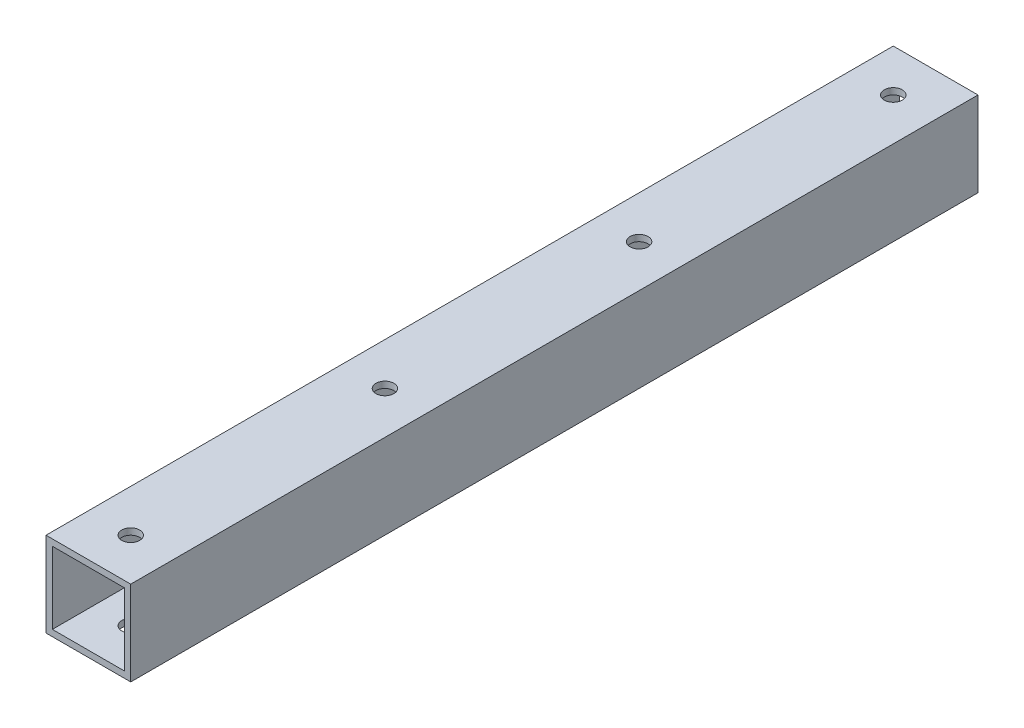
ISO-10303-21;
HEADER;
FILE_DESCRIPTION(('STEP AP214'),'2;1');
FILE_NAME('part.step','',(''),(''),'','','');
FILE_SCHEMA(('AUTOMOTIVE_DESIGN { 1 0 10303 214 1 1 1 1 }'));
ENDSEC;
DATA;
#1=APPLICATION_CONTEXT('core data for automotive mechanical design processes');
#2=APPLICATION_PROTOCOL_DEFINITION('international standard','automotive_design',2000,#1);
#3=PRODUCT_CONTEXT('',#1,'mechanical');
#4=PRODUCT('Part','Part','',(#3));
#5=PRODUCT_RELATED_PRODUCT_CATEGORY('part','',(#4));
#6=PRODUCT_DEFINITION_FORMATION('','',#4);
#7=PRODUCT_DEFINITION_CONTEXT('part definition',#1,'design');
#8=PRODUCT_DEFINITION('design','',#6,#7);
#9=PRODUCT_DEFINITION_SHAPE('','',#8);
#10=(LENGTH_UNIT() NAMED_UNIT(*) SI_UNIT(.MILLI.,.METRE.));
#11=(NAMED_UNIT(*) PLANE_ANGLE_UNIT() SI_UNIT($,.RADIAN.));
#12=(NAMED_UNIT(*) SI_UNIT($,.STERADIAN.) SOLID_ANGLE_UNIT());
#13=UNCERTAINTY_MEASURE_WITH_UNIT(LENGTH_MEASURE(1.E-05),#10,'distance_accuracy_value','');
#14=(GEOMETRIC_REPRESENTATION_CONTEXT(3) GLOBAL_UNCERTAINTY_ASSIGNED_CONTEXT((#13)) GLOBAL_UNIT_ASSIGNED_CONTEXT((#10,
#11,#12)) REPRESENTATION_CONTEXT('',''));
#15=CARTESIAN_POINT('',(0.,0.,0.));
#16=DIRECTION('',(0.,0.,1.));
#17=DIRECTION('',(1.,0.,0.));
#18=AXIS2_PLACEMENT_3D('',#15,#16,#17);
#19=CARTESIAN_POINT('',(10.,-9.99999999999999,-200.));
#20=DIRECTION('',(1.,0.,0.));
#21=DIRECTION('',(0.,0.,-1.));
#22=AXIS2_PLACEMENT_3D('',#19,#20,#21);
#23=PLANE('',#22);
#24=DIRECTION('',(0.,1.,0.));
#25=VECTOR('',#24,1.);
#26=CARTESIAN_POINT('',(10.,-9.99999999999999,0.));
#27=LINE('',#26,#25);
#28=CARTESIAN_POINT('',(10.,-9.99999999999999,0.));
#29=VERTEX_POINT('',#28);
#30=CARTESIAN_POINT('',(10.,10.,0.));
#31=VERTEX_POINT('',#30);
#32=EDGE_CURVE('E142',#29,#31,#27,.T.);
#33=ORIENTED_EDGE('',*,*,#32,.F.);
#34=DIRECTION('',(0.,0.,1.));
#35=VECTOR('',#34,1.);
#36=CARTESIAN_POINT('',(10.,-9.99999999999999,-200.));
#37=LINE('',#36,#35);
#38=CARTESIAN_POINT('',(10.,-9.99999999999999,-200.));
#39=VERTEX_POINT('',#38);
#40=EDGE_CURVE('E11',#39,#29,#37,.T.);
#41=ORIENTED_EDGE('',*,*,#40,.F.);
#42=DIRECTION('',(0.,1.,0.));
#43=VECTOR('',#42,1.);
#44=CARTESIAN_POINT('',(10.,-9.99999999999999,-200.));
#45=LINE('',#44,#43);
#46=CARTESIAN_POINT('',(10.,10.,-200.));
#47=VERTEX_POINT('',#46);
#48=EDGE_CURVE('E146',#39,#47,#45,.T.);
#49=ORIENTED_EDGE('',*,*,#48,.T.);
#50=DIRECTION('',(0.,0.,1.));
#51=VECTOR('',#50,1.);
#52=CARTESIAN_POINT('',(10.,10.,-200.));
#53=LINE('',#52,#51);
#54=EDGE_CURVE('E159',#47,#31,#53,.T.);
#55=ORIENTED_EDGE('',*,*,#54,.T.);
#56=EDGE_LOOP('',(#33,#41,#49,#55));
#57=FACE_BOUND('',#56,.T.);
#58=ADVANCED_FACE('F41',(#57),#23,.T.);
#59=CARTESIAN_POINT('',(-9.99999999999998,-9.99999999999999,-200.));
#60=DIRECTION('',(0.,-1.,0.));
#61=DIRECTION('',(0.,0.,-1.));
#62=AXIS2_PLACEMENT_3D('',#59,#60,#61);
#63=PLANE('',#62);
#64=CARTESIAN_POINT('',(0.,-9.99999999999999,-10.));
#65=DIRECTION('',(0.,1.,0.));
#66=DIRECTION('',(0.,0.,1.));
#67=AXIS2_PLACEMENT_3D('',#64,#65,#66);
#68=CIRCLE('',#67,2.125);
#69=CARTESIAN_POINT('',(0.,-9.99999999999999,-7.875));
#70=VERTEX_POINT('',#69);
#71=EDGE_CURVE('E178',#70,#70,#68,.T.);
#72=ORIENTED_EDGE('',*,*,#71,.T.);
#73=EDGE_LOOP('',(#72));
#74=FACE_BOUND('',#73,.T.);
#75=CARTESIAN_POINT('',(-2.05814939933146E-13,-9.99999999999999,-70.));
#76=DIRECTION('',(0.,1.,0.));
#77=DIRECTION('',(0.,0.,1.));
#78=AXIS2_PLACEMENT_3D('',#75,#76,#77);
#79=CIRCLE('',#78,2.125);
#80=CARTESIAN_POINT('',(-2.05814939933146E-13,-9.99999999999999,-67.875));
#81=VERTEX_POINT('',#80);
#82=EDGE_CURVE('E207',#81,#81,#79,.T.);
#83=ORIENTED_EDGE('',*,*,#82,.T.);
#84=EDGE_LOOP('',(#83));
#85=FACE_BOUND('',#84,.T.);
#86=CARTESIAN_POINT('',(-4.11629879866292E-13,-9.99999999999999,-130.));
#87=DIRECTION('',(0.,1.,0.));
#88=DIRECTION('',(0.,0.,1.));
#89=AXIS2_PLACEMENT_3D('',#86,#87,#88);
#90=CIRCLE('',#89,2.125);
#91=CARTESIAN_POINT('',(-4.11629879866292E-13,-9.99999999999999,-127.875));
#92=VERTEX_POINT('',#91);
#93=EDGE_CURVE('E201',#92,#92,#90,.T.);
#94=ORIENTED_EDGE('',*,*,#93,.T.);
#95=EDGE_LOOP('',(#94));
#96=FACE_BOUND('',#95,.T.);
#97=CARTESIAN_POINT('',(-6.17444819799438E-13,-9.99999999999999,-190.));
#98=DIRECTION('',(0.,1.,0.));
#99=DIRECTION('',(0.,0.,1.));
#100=AXIS2_PLACEMENT_3D('',#97,#98,#99);
#101=CIRCLE('',#100,2.125);
#102=CARTESIAN_POINT('',(-6.17444819799438E-13,-9.99999999999999,-187.875));
#103=VERTEX_POINT('',#102);
#104=EDGE_CURVE('E195',#103,#103,#101,.T.);
#105=ORIENTED_EDGE('',*,*,#104,.T.);
#106=EDGE_LOOP('',(#105));
#107=FACE_BOUND('',#106,.T.);
#108=DIRECTION('',(1.,0.,0.));
#109=VECTOR('',#108,1.);
#110=CARTESIAN_POINT('',(-9.99999999999998,-9.99999999999999,0.));
#111=LINE('',#110,#109);
#112=CARTESIAN_POINT('',(-9.99999999999998,-9.99999999999999,0.));
#113=VERTEX_POINT('',#112);
#114=EDGE_CURVE('E150',#113,#29,#111,.T.);
#115=ORIENTED_EDGE('',*,*,#114,.F.);
#116=DIRECTION('',(0.,0.,1.));
#117=VECTOR('',#116,1.);
#118=CARTESIAN_POINT('',(-9.99999999999998,-9.99999999999999,-200.));
#119=LINE('',#118,#117);
#120=CARTESIAN_POINT('',(-9.99999999999998,-9.99999999999999,-200.));
#121=VERTEX_POINT('',#120);
#122=EDGE_CURVE('E49',#121,#113,#119,.T.);
#123=ORIENTED_EDGE('',*,*,#122,.F.);
#124=DIRECTION('',(1.,0.,0.));
#125=VECTOR('',#124,1.);
#126=CARTESIAN_POINT('',(-9.99999999999998,-9.99999999999999,-200.));
#127=LINE('',#126,#125);
#128=EDGE_CURVE('E156',#121,#39,#127,.T.);
#129=ORIENTED_EDGE('',*,*,#128,.T.);
#130=ORIENTED_EDGE('',*,*,#40,.T.);
#131=EDGE_LOOP('',(#115,#123,#129,#130));
#132=FACE_BOUND('',#131,.T.);
#133=ADVANCED_FACE('F219',(#74,#85,#96,#107,#132),#63,.T.);
#134=CARTESIAN_POINT('',(-9.99999999999998,-9.99999999999999,-200.));
#135=DIRECTION('',(-1.,0.,0.));
#136=DIRECTION('',(0.,0.,1.));
#137=AXIS2_PLACEMENT_3D('',#134,#135,#136);
#138=PLANE('',#137);
#139=DIRECTION('',(0.,-1.,0.));
#140=VECTOR('',#139,1.);
#141=CARTESIAN_POINT('',(-9.99999999999998,-9.99999999999999,0.));
#142=LINE('',#141,#140);
#143=CARTESIAN_POINT('',(-9.99999999999998,10.,0.));
#144=VERTEX_POINT('',#143);
#145=EDGE_CURVE('E165',#144,#113,#142,.T.);
#146=ORIENTED_EDGE('',*,*,#145,.F.);
#147=DIRECTION('',(0.,0.,1.));
#148=VECTOR('',#147,1.);
#149=CARTESIAN_POINT('',(-9.99999999999998,10.,-200.));
#150=LINE('',#149,#148);
#151=CARTESIAN_POINT('',(-9.99999999999998,10.,-200.));
#152=VERTEX_POINT('',#151);
#153=EDGE_CURVE('E171',#152,#144,#150,.T.);
#154=ORIENTED_EDGE('',*,*,#153,.F.);
#155=DIRECTION('',(0.,-1.,0.));
#156=VECTOR('',#155,1.);
#157=CARTESIAN_POINT('',(-9.99999999999998,-9.99999999999999,-200.));
#158=LINE('',#157,#156);
#159=EDGE_CURVE('E153',#152,#121,#158,.T.);
#160=ORIENTED_EDGE('',*,*,#159,.T.);
#161=ORIENTED_EDGE('',*,*,#122,.T.);
#162=EDGE_LOOP('',(#146,#154,#160,#161));
#163=FACE_BOUND('',#162,.T.);
#164=ADVANCED_FACE('F253',(#163),#138,.T.);
#165=CARTESIAN_POINT('',(-9.99999999999998,10.,-200.));
#166=DIRECTION('',(0.,1.,0.));
#167=DIRECTION('',(0.,0.,1.));
#168=AXIS2_PLACEMENT_3D('',#165,#166,#167);
#169=PLANE('',#168);
#170=CARTESIAN_POINT('',(0.,10.,-10.));
#171=DIRECTION('',(0.,1.,0.));
#172=DIRECTION('',(0.,0.,1.));
#173=AXIS2_PLACEMENT_3D('',#170,#171,#172);
#174=CIRCLE('',#173,2.125);
#175=CARTESIAN_POINT('',(0.,10.,-7.875));
#176=VERTEX_POINT('',#175);
#177=EDGE_CURVE('E213',#176,#176,#174,.T.);
#178=ORIENTED_EDGE('',*,*,#177,.F.);
#179=EDGE_LOOP('',(#178));
#180=FACE_BOUND('',#179,.T.);
#181=CARTESIAN_POINT('',(-2.05814939933146E-13,10.,-70.));
#182=DIRECTION('',(0.,1.,0.));
#183=DIRECTION('',(0.,0.,1.));
#184=AXIS2_PLACEMENT_3D('',#181,#182,#183);
#185=CIRCLE('',#184,2.125);
#186=CARTESIAN_POINT('',(-2.05814939933146E-13,10.,-67.875));
#187=VERTEX_POINT('',#186);
#188=EDGE_CURVE('E210',#187,#187,#185,.T.);
#189=ORIENTED_EDGE('',*,*,#188,.F.);
#190=EDGE_LOOP('',(#189));
#191=FACE_BOUND('',#190,.T.);
#192=CARTESIAN_POINT('',(-4.11629879866292E-13,10.,-130.));
#193=DIRECTION('',(0.,1.,0.));
#194=DIRECTION('',(0.,0.,1.));
#195=AXIS2_PLACEMENT_3D('',#192,#193,#194);
#196=CIRCLE('',#195,2.125);
#197=CARTESIAN_POINT('',(-4.11629879866292E-13,10.,-127.875));
#198=VERTEX_POINT('',#197);
#199=EDGE_CURVE('E204',#198,#198,#196,.T.);
#200=ORIENTED_EDGE('',*,*,#199,.F.);
#201=EDGE_LOOP('',(#200));
#202=FACE_BOUND('',#201,.T.);
#203=CARTESIAN_POINT('',(-6.17444819799438E-13,10.,-190.));
#204=DIRECTION('',(0.,1.,0.));
#205=DIRECTION('',(0.,0.,1.));
#206=AXIS2_PLACEMENT_3D('',#203,#204,#205);
#207=CIRCLE('',#206,2.125);
#208=CARTESIAN_POINT('',(-6.17444819799438E-13,10.,-187.875));
#209=VERTEX_POINT('',#208);
#210=EDGE_CURVE('E198',#209,#209,#207,.T.);
#211=ORIENTED_EDGE('',*,*,#210,.F.);
#212=EDGE_LOOP('',(#211));
#213=FACE_BOUND('',#212,.T.);
#214=DIRECTION('',(-1.,0.,0.));
#215=VECTOR('',#214,1.);
#216=CARTESIAN_POINT('',(-9.99999999999998,10.,0.));
#217=LINE('',#216,#215);
#218=EDGE_CURVE('E162',#31,#144,#217,.T.);
#219=ORIENTED_EDGE('',*,*,#218,.F.);
#220=ORIENTED_EDGE('',*,*,#54,.F.);
#221=DIRECTION('',(-1.,0.,0.));
#222=VECTOR('',#221,1.);
#223=CARTESIAN_POINT('',(-9.99999999999998,10.,-200.));
#224=LINE('',#223,#222);
#225=EDGE_CURVE('E149',#47,#152,#224,.T.);
#226=ORIENTED_EDGE('',*,*,#225,.T.);
#227=ORIENTED_EDGE('',*,*,#153,.T.);
#228=EDGE_LOOP('',(#219,#220,#226,#227));
#229=FACE_BOUND('',#228,.T.);
#230=ADVANCED_FACE('F267',(#180,#191,#202,#213,#229),#169,.T.);
#231=CARTESIAN_POINT('',(0.,0.,-200.));
#232=DIRECTION('',(0.,0.,-1.));
#233=DIRECTION('',(-1.,0.,0.));
#234=AXIS2_PLACEMENT_3D('',#231,#232,#233);
#235=PLANE('',#234);
#236=DIRECTION('',(0.,-1.,0.));
#237=VECTOR('',#236,1.);
#238=CARTESIAN_POINT('',(-8.49999999999998,-8.49999999999999,-200.));
#239=LINE('',#238,#237);
#240=CARTESIAN_POINT('',(-8.49999999999998,8.50000000000002,-200.));
#241=VERTEX_POINT('',#240);
#242=CARTESIAN_POINT('',(-8.49999999999998,-8.49999999999999,-200.));
#243=VERTEX_POINT('',#242);
#244=EDGE_CURVE('E108',#241,#243,#239,.T.);
#245=ORIENTED_EDGE('',*,*,#244,.T.);
#246=DIRECTION('',(1.,0.,0.));
#247=VECTOR('',#246,1.);
#248=CARTESIAN_POINT('',(-8.49999999999998,-8.49999999999999,-200.));
#249=LINE('',#248,#247);
#250=CARTESIAN_POINT('',(8.50000000000002,-8.49999999999999,-200.));
#251=VERTEX_POINT('',#250);
#252=EDGE_CURVE('E117',#243,#251,#249,.T.);
#253=ORIENTED_EDGE('',*,*,#252,.T.);
#254=DIRECTION('',(0.,1.,0.));
#255=VECTOR('',#254,1.);
#256=CARTESIAN_POINT('',(8.50000000000002,-8.49999999999999,-200.));
#257=LINE('',#256,#255);
#258=CARTESIAN_POINT('',(8.50000000000002,8.50000000000002,-200.));
#259=VERTEX_POINT('',#258);
#260=EDGE_CURVE('E57',#251,#259,#257,.T.);
#261=ORIENTED_EDGE('',*,*,#260,.T.);
#262=DIRECTION('',(-1.,0.,0.));
#263=VECTOR('',#262,1.);
#264=CARTESIAN_POINT('',(-8.49999999999998,8.50000000000002,-200.));
#265=LINE('',#264,#263);
#266=EDGE_CURVE('E114',#259,#241,#265,.T.);
#267=ORIENTED_EDGE('',*,*,#266,.T.);
#268=EDGE_LOOP('',(#245,#253,#261,#267));
#269=FACE_BOUND('',#268,.T.);
#270=ORIENTED_EDGE('',*,*,#48,.F.);
#271=ORIENTED_EDGE('',*,*,#128,.F.);
#272=ORIENTED_EDGE('',*,*,#159,.F.);
#273=ORIENTED_EDGE('',*,*,#225,.F.);
#274=EDGE_LOOP('',(#270,#271,#272,#273));
#275=FACE_BOUND('',#274,.T.);
#276=ADVANCED_FACE('F121',(#269,#275),#235,.T.);
#277=CARTESIAN_POINT('',(0.,0.,0.));
#278=DIRECTION('',(0.,0.,-1.));
#279=DIRECTION('',(-1.,0.,0.));
#280=AXIS2_PLACEMENT_3D('',#277,#278,#279);
#281=PLANE('',#280);
#282=DIRECTION('',(1.,0.,0.));
#283=VECTOR('',#282,1.);
#284=CARTESIAN_POINT('',(-8.49999999999998,-8.49999999999999,0.));
#285=LINE('',#284,#283);
#286=CARTESIAN_POINT('',(-8.49999999999998,-8.49999999999999,0.));
#287=VERTEX_POINT('',#286);
#288=CARTESIAN_POINT('',(8.50000000000002,-8.49999999999999,0.));
#289=VERTEX_POINT('',#288);
#290=EDGE_CURVE('E136',#287,#289,#285,.T.);
#291=ORIENTED_EDGE('',*,*,#290,.F.);
#292=DIRECTION('',(0.,-1.,0.));
#293=VECTOR('',#292,1.);
#294=CARTESIAN_POINT('',(-8.49999999999998,-8.49999999999999,0.));
#295=LINE('',#294,#293);
#296=CARTESIAN_POINT('',(-8.49999999999998,8.50000000000002,0.));
#297=VERTEX_POINT('',#296);
#298=EDGE_CURVE('E65',#297,#287,#295,.T.);
#299=ORIENTED_EDGE('',*,*,#298,.F.);
#300=DIRECTION('',(-1.,0.,0.));
#301=VECTOR('',#300,1.);
#302=CARTESIAN_POINT('',(-8.49999999999998,8.50000000000002,0.));
#303=LINE('',#302,#301);
#304=CARTESIAN_POINT('',(8.50000000000002,8.50000000000002,0.));
#305=VERTEX_POINT('',#304);
#306=EDGE_CURVE('E124',#305,#297,#303,.T.);
#307=ORIENTED_EDGE('',*,*,#306,.F.);
#308=DIRECTION('',(0.,1.,0.));
#309=VECTOR('',#308,1.);
#310=CARTESIAN_POINT('',(8.50000000000002,-8.49999999999999,0.));
#311=LINE('',#310,#309);
#312=EDGE_CURVE('E127',#289,#305,#311,.T.);
#313=ORIENTED_EDGE('',*,*,#312,.F.);
#314=EDGE_LOOP('',(#291,#299,#307,#313));
#315=FACE_BOUND('',#314,.T.);
#316=ORIENTED_EDGE('',*,*,#32,.T.);
#317=ORIENTED_EDGE('',*,*,#218,.T.);
#318=ORIENTED_EDGE('',*,*,#145,.T.);
#319=ORIENTED_EDGE('',*,*,#114,.T.);
#320=EDGE_LOOP('',(#316,#317,#318,#319));
#321=FACE_BOUND('',#320,.T.);
#322=ADVANCED_FACE('F260',(#315,#321),#281,.F.);
#323=CARTESIAN_POINT('',(-8.49999999999998,-8.49999999999999,-200.));
#324=DIRECTION('',(-1.,0.,0.));
#325=DIRECTION('',(0.,0.,1.));
#326=AXIS2_PLACEMENT_3D('',#323,#324,#325);
#327=PLANE('',#326);
#328=ORIENTED_EDGE('',*,*,#298,.T.);
#329=DIRECTION('',(0.,0.,1.));
#330=VECTOR('',#329,1.);
#331=CARTESIAN_POINT('',(-8.49999999999998,-8.49999999999999,-200.));
#332=LINE('',#331,#330);
#333=EDGE_CURVE('E104',#243,#287,#332,.T.);
#334=ORIENTED_EDGE('',*,*,#333,.F.);
#335=ORIENTED_EDGE('',*,*,#244,.F.);
#336=DIRECTION('',(0.,0.,1.));
#337=VECTOR('',#336,1.);
#338=CARTESIAN_POINT('',(-8.49999999999998,8.50000000000002,-200.));
#339=LINE('',#338,#337);
#340=EDGE_CURVE('E140',#241,#297,#339,.T.);
#341=ORIENTED_EDGE('',*,*,#340,.T.);
#342=EDGE_LOOP('',(#328,#334,#335,#341));
#343=FACE_BOUND('',#342,.T.);
#344=ADVANCED_FACE('F106',(#343),#327,.F.);
#345=CARTESIAN_POINT('',(-8.49999999999998,8.50000000000002,-200.));
#346=DIRECTION('',(0.,1.,0.));
#347=DIRECTION('',(0.,0.,1.));
#348=AXIS2_PLACEMENT_3D('',#345,#346,#347);
#349=PLANE('',#348);
#350=CARTESIAN_POINT('',(0.,8.50000000000002,-10.));
#351=DIRECTION('',(0.,1.,0.));
#352=DIRECTION('',(0.,0.,1.));
#353=AXIS2_PLACEMENT_3D('',#350,#351,#352);
#354=CIRCLE('',#353,2.125);
#355=CARTESIAN_POINT('',(0.,8.50000000000002,-7.875));
#356=VERTEX_POINT('',#355);
#357=EDGE_CURVE('E130',#356,#356,#354,.T.);
#358=ORIENTED_EDGE('',*,*,#357,.T.);
#359=EDGE_LOOP('',(#358));
#360=FACE_BOUND('',#359,.T.);
#361=CARTESIAN_POINT('',(-2.05814939933146E-13,8.50000000000002,-70.));
#362=DIRECTION('',(0.,1.,0.));
#363=DIRECTION('',(0.,0.,1.));
#364=AXIS2_PLACEMENT_3D('',#361,#362,#363);
#365=CIRCLE('',#364,2.125);
#366=CARTESIAN_POINT('',(-2.05814939933146E-13,8.50000000000002,-67.875));
#367=VERTEX_POINT('',#366);
#368=EDGE_CURVE('E184',#367,#367,#365,.T.);
#369=ORIENTED_EDGE('',*,*,#368,.T.);
#370=EDGE_LOOP('',(#369));
#371=FACE_BOUND('',#370,.T.);
#372=CARTESIAN_POINT('',(-4.11629879866292E-13,8.50000000000002,-130.));
#373=DIRECTION('',(0.,1.,0.));
#374=DIRECTION('',(0.,0.,1.));
#375=AXIS2_PLACEMENT_3D('',#372,#373,#374);
#376=CIRCLE('',#375,2.125);
#377=CARTESIAN_POINT('',(-4.11629879866292E-13,8.50000000000002,-127.875));
#378=VERTEX_POINT('',#377);
#379=EDGE_CURVE('E181',#378,#378,#376,.T.);
#380=ORIENTED_EDGE('',*,*,#379,.T.);
#381=EDGE_LOOP('',(#380));
#382=FACE_BOUND('',#381,.T.);
#383=CARTESIAN_POINT('',(-6.17444819799438E-13,8.50000000000002,-190.));
#384=DIRECTION('',(0.,1.,0.));
#385=DIRECTION('',(0.,0.,1.));
#386=AXIS2_PLACEMENT_3D('',#383,#384,#385);
#387=CIRCLE('',#386,2.125);
#388=CARTESIAN_POINT('',(-6.17444819799438E-13,8.50000000000002,-187.875));
#389=VERTEX_POINT('',#388);
#390=EDGE_CURVE('E177',#389,#389,#387,.T.);
#391=ORIENTED_EDGE('',*,*,#390,.T.);
#392=EDGE_LOOP('',(#391));
#393=FACE_BOUND('',#392,.T.);
#394=ORIENTED_EDGE('',*,*,#306,.T.);
#395=ORIENTED_EDGE('',*,*,#340,.F.);
#396=ORIENTED_EDGE('',*,*,#266,.F.);
#397=DIRECTION('',(0.,0.,1.));
#398=VECTOR('',#397,1.);
#399=CARTESIAN_POINT('',(8.50000000000002,8.50000000000002,-200.));
#400=LINE('',#399,#398);
#401=EDGE_CURVE('E143',#259,#305,#400,.T.);
#402=ORIENTED_EDGE('',*,*,#401,.T.);
#403=EDGE_LOOP('',(#394,#395,#396,#402));
#404=FACE_BOUND('',#403,.T.);
#405=ADVANCED_FACE('F235',(#360,#371,#382,#393,#404),#349,.F.);
#406=CARTESIAN_POINT('',(8.50000000000002,-8.49999999999999,-200.));
#407=DIRECTION('',(1.,0.,0.));
#408=DIRECTION('',(0.,0.,-1.));
#409=AXIS2_PLACEMENT_3D('',#406,#407,#408);
#410=PLANE('',#409);
#411=ORIENTED_EDGE('',*,*,#312,.T.);
#412=ORIENTED_EDGE('',*,*,#401,.F.);
#413=ORIENTED_EDGE('',*,*,#260,.F.);
#414=DIRECTION('',(0.,0.,1.));
#415=VECTOR('',#414,1.);
#416=CARTESIAN_POINT('',(8.50000000000002,-8.49999999999999,-200.));
#417=LINE('',#416,#415);
#418=EDGE_CURVE('E113',#251,#289,#417,.T.);
#419=ORIENTED_EDGE('',*,*,#418,.T.);
#420=EDGE_LOOP('',(#411,#412,#413,#419));
#421=FACE_BOUND('',#420,.T.);
#422=ADVANCED_FACE('F285',(#421),#410,.F.);
#423=CARTESIAN_POINT('',(-8.49999999999998,-8.49999999999999,-200.));
#424=DIRECTION('',(0.,-1.,0.));
#425=DIRECTION('',(0.,0.,-1.));
#426=AXIS2_PLACEMENT_3D('',#423,#424,#425);
#427=PLANE('',#426);
#428=CARTESIAN_POINT('',(0.,-8.49999999999999,-10.));
#429=DIRECTION('',(0.,-1.,0.));
#430=DIRECTION('',(0.,0.,-1.));
#431=AXIS2_PLACEMENT_3D('',#428,#429,#430);
#432=CIRCLE('',#431,2.125);
#433=CARTESIAN_POINT('',(0.,-8.49999999999999,-12.125));
#434=VERTEX_POINT('',#433);
#435=EDGE_CURVE('E44',#434,#434,#432,.T.);
#436=ORIENTED_EDGE('',*,*,#435,.T.);
#437=EDGE_LOOP('',(#436));
#438=FACE_BOUND('',#437,.T.);
#439=CARTESIAN_POINT('',(-2.05814939933146E-13,-8.49999999999999,-70.));
#440=DIRECTION('',(0.,-1.,0.));
#441=DIRECTION('',(0.,0.,-1.));
#442=AXIS2_PLACEMENT_3D('',#439,#440,#441);
#443=CIRCLE('',#442,2.125);
#444=CARTESIAN_POINT('',(-2.05814939933146E-13,-8.49999999999999,-72.125));
#445=VERTEX_POINT('',#444);
#446=EDGE_CURVE('E182',#445,#445,#443,.T.);
#447=ORIENTED_EDGE('',*,*,#446,.T.);
#448=EDGE_LOOP('',(#447));
#449=FACE_BOUND('',#448,.T.);
#450=CARTESIAN_POINT('',(-4.11629879866292E-13,-8.49999999999999,-130.));
#451=DIRECTION('',(0.,-1.,0.));
#452=DIRECTION('',(0.,0.,-1.));
#453=AXIS2_PLACEMENT_3D('',#450,#451,#452);
#454=CIRCLE('',#453,2.125);
#455=CARTESIAN_POINT('',(-4.11629879866292E-13,-8.49999999999999,-132.125));
#456=VERTEX_POINT('',#455);
#457=EDGE_CURVE('E179',#456,#456,#454,.T.);
#458=ORIENTED_EDGE('',*,*,#457,.T.);
#459=EDGE_LOOP('',(#458));
#460=FACE_BOUND('',#459,.T.);
#461=CARTESIAN_POINT('',(-6.17444819799438E-13,-8.49999999999999,-190.));
#462=DIRECTION('',(0.,-1.,0.));
#463=DIRECTION('',(0.,0.,-1.));
#464=AXIS2_PLACEMENT_3D('',#461,#462,#463);
#465=CIRCLE('',#464,2.125);
#466=CARTESIAN_POINT('',(-6.17444819799438E-13,-8.49999999999999,-192.125));
#467=VERTEX_POINT('',#466);
#468=EDGE_CURVE('E174',#467,#467,#465,.T.);
#469=ORIENTED_EDGE('',*,*,#468,.T.);
#470=EDGE_LOOP('',(#469));
#471=FACE_BOUND('',#470,.T.);
#472=ORIENTED_EDGE('',*,*,#290,.T.);
#473=ORIENTED_EDGE('',*,*,#418,.F.);
#474=ORIENTED_EDGE('',*,*,#252,.F.);
#475=ORIENTED_EDGE('',*,*,#333,.T.);
#476=EDGE_LOOP('',(#472,#473,#474,#475));
#477=FACE_BOUND('',#476,.T.);
#478=ADVANCED_FACE('F118',(#438,#449,#460,#471,#477),#427,.F.);
#479=CARTESIAN_POINT('',(-6.17444819799438E-13,-9.99999999999999,-190.));
#480=DIRECTION('',(0.,1.,0.));
#481=DIRECTION('',(0.,0.,1.));
#482=AXIS2_PLACEMENT_3D('',#479,#480,#481);
#483=CYLINDRICAL_SURFACE('',#482,2.125);
#484=ORIENTED_EDGE('',*,*,#104,.F.);
#485=EDGE_LOOP('',(#484));
#486=FACE_BOUND('',#485,.T.);
#487=ORIENTED_EDGE('',*,*,#468,.F.);
#488=EDGE_LOOP('',(#487));
#489=FACE_BOUND('',#488,.T.);
#490=ADVANCED_FACE('F284',(#486,#489),#483,.F.);
#491=CARTESIAN_POINT('',(-4.11629879866292E-13,-9.99999999999999,-130.));
#492=DIRECTION('',(0.,1.,0.));
#493=DIRECTION('',(0.,0.,1.));
#494=AXIS2_PLACEMENT_3D('',#491,#492,#493);
#495=CYLINDRICAL_SURFACE('',#494,2.125);
#496=ORIENTED_EDGE('',*,*,#93,.F.);
#497=EDGE_LOOP('',(#496));
#498=FACE_BOUND('',#497,.T.);
#499=ORIENTED_EDGE('',*,*,#457,.F.);
#500=EDGE_LOOP('',(#499));
#501=FACE_BOUND('',#500,.T.);
#502=ADVANCED_FACE('F295',(#498,#501),#495,.F.);
#503=CARTESIAN_POINT('',(-2.05814939933146E-13,-9.99999999999999,-70.));
#504=DIRECTION('',(0.,1.,0.));
#505=DIRECTION('',(0.,0.,1.));
#506=AXIS2_PLACEMENT_3D('',#503,#504,#505);
#507=CYLINDRICAL_SURFACE('',#506,2.125);
#508=ORIENTED_EDGE('',*,*,#82,.F.);
#509=EDGE_LOOP('',(#508));
#510=FACE_BOUND('',#509,.T.);
#511=ORIENTED_EDGE('',*,*,#446,.F.);
#512=EDGE_LOOP('',(#511));
#513=FACE_BOUND('',#512,.T.);
#514=ADVANCED_FACE('F226',(#510,#513),#507,.F.);
#515=CARTESIAN_POINT('',(0.,-9.99999999999999,-10.));
#516=DIRECTION('',(0.,1.,0.));
#517=DIRECTION('',(0.,0.,1.));
#518=AXIS2_PLACEMENT_3D('',#515,#516,#517);
#519=CYLINDRICAL_SURFACE('',#518,2.125);
#520=ORIENTED_EDGE('',*,*,#71,.F.);
#521=EDGE_LOOP('',(#520));
#522=FACE_BOUND('',#521,.T.);
#523=ORIENTED_EDGE('',*,*,#435,.F.);
#524=EDGE_LOOP('',(#523));
#525=FACE_BOUND('',#524,.T.);
#526=ADVANCED_FACE('F222',(#522,#525),#519,.F.);
#527=ORIENTED_EDGE('',*,*,#210,.T.);
#528=EDGE_LOOP('',(#527));
#529=FACE_BOUND('',#528,.T.);
#530=ORIENTED_EDGE('',*,*,#390,.F.);
#531=EDGE_LOOP('',(#530));
#532=FACE_BOUND('',#531,.T.);
#533=ADVANCED_FACE('F225',(#529,#532),#483,.F.);
#534=ORIENTED_EDGE('',*,*,#199,.T.);
#535=EDGE_LOOP('',(#534));
#536=FACE_BOUND('',#535,.T.);
#537=ORIENTED_EDGE('',*,*,#379,.F.);
#538=EDGE_LOOP('',(#537));
#539=FACE_BOUND('',#538,.T.);
#540=ADVANCED_FACE('F244',(#536,#539),#495,.F.);
#541=ORIENTED_EDGE('',*,*,#188,.T.);
#542=EDGE_LOOP('',(#541));
#543=FACE_BOUND('',#542,.T.);
#544=ORIENTED_EDGE('',*,*,#368,.F.);
#545=EDGE_LOOP('',(#544));
#546=FACE_BOUND('',#545,.T.);
#547=ADVANCED_FACE('F239',(#543,#546),#507,.F.);
#548=ORIENTED_EDGE('',*,*,#177,.T.);
#549=EDGE_LOOP('',(#548));
#550=FACE_BOUND('',#549,.T.);
#551=ORIENTED_EDGE('',*,*,#357,.F.);
#552=EDGE_LOOP('',(#551));
#553=FACE_BOUND('',#552,.T.);
#554=ADVANCED_FACE('F228',(#550,#553),#519,.F.);
#555=CLOSED_SHELL('',(#58,#133,#164,#230,#276,#322,#344,#405,#422,#478,#490,#502,#514,#526,#533,
#540,#547,#554));
#556=MANIFOLD_SOLID_BREP('B2',#555);
#557=ADVANCED_BREP_SHAPE_REPRESENTATION('',(#18,#556),#14);
#558=SHAPE_DEFINITION_REPRESENTATION(#9,#557);
ENDSEC;
END-ISO-10303-21;
